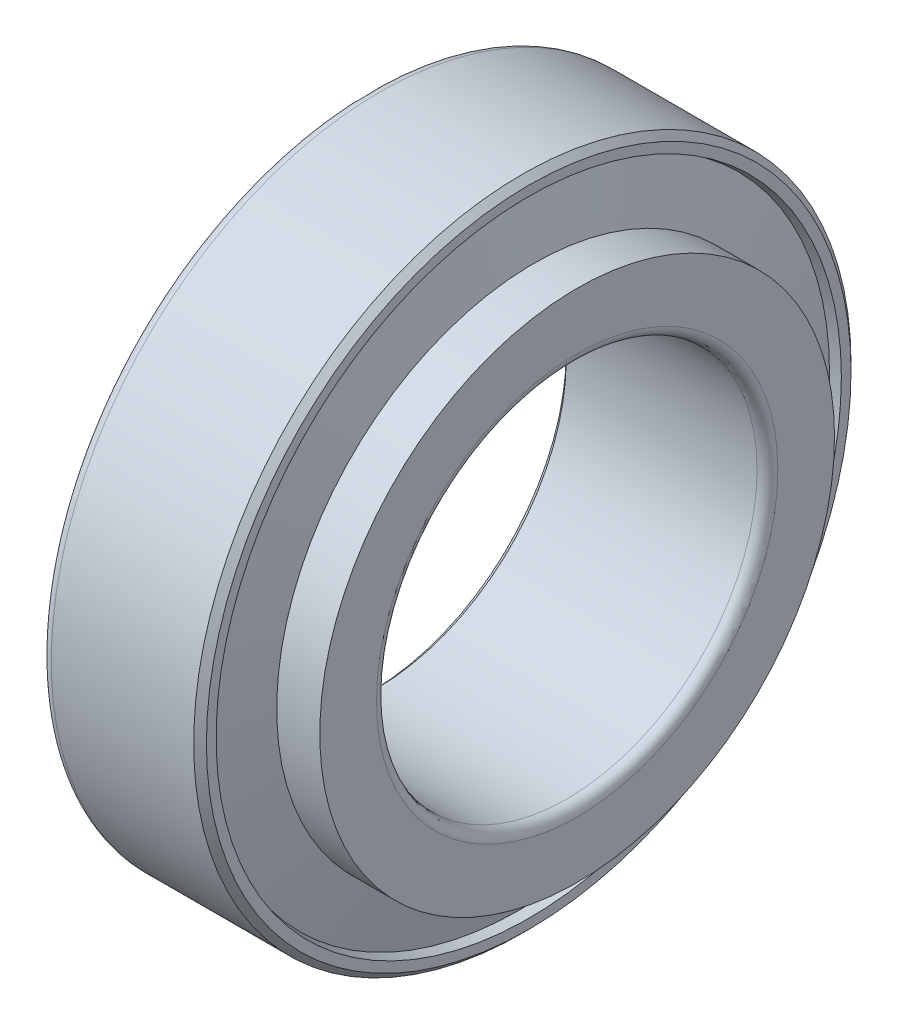
ISO-10303-21;
HEADER;
FILE_DESCRIPTION(('STEP AP214'),'2;1');
FILE_NAME('part.step','',(''),(''),'','','');
FILE_SCHEMA(('AUTOMOTIVE_DESIGN { 1 0 10303 214 1 1 1 1 }'));
ENDSEC;
DATA;
#1=APPLICATION_CONTEXT('core data for automotive mechanical design processes');
#2=APPLICATION_PROTOCOL_DEFINITION('international standard','automotive_design',2000,#1);
#3=PRODUCT_CONTEXT('',#1,'mechanical');
#4=PRODUCT('Part','Part','',(#3));
#5=PRODUCT_RELATED_PRODUCT_CATEGORY('part','',(#4));
#6=PRODUCT_DEFINITION_FORMATION('','',#4);
#7=PRODUCT_DEFINITION_CONTEXT('part definition',#1,'design');
#8=PRODUCT_DEFINITION('design','',#6,#7);
#9=PRODUCT_DEFINITION_SHAPE('','',#8);
#10=(LENGTH_UNIT() NAMED_UNIT(*) SI_UNIT(.MILLI.,.METRE.));
#11=(NAMED_UNIT(*) PLANE_ANGLE_UNIT() SI_UNIT($,.RADIAN.));
#12=(NAMED_UNIT(*) SI_UNIT($,.STERADIAN.) SOLID_ANGLE_UNIT());
#13=UNCERTAINTY_MEASURE_WITH_UNIT(LENGTH_MEASURE(1.E-05),#10,'distance_accuracy_value','');
#14=(GEOMETRIC_REPRESENTATION_CONTEXT(3) GLOBAL_UNCERTAINTY_ASSIGNED_CONTEXT((#13)) GLOBAL_UNIT_ASSIGNED_CONTEXT((#10,
#11,#12)) REPRESENTATION_CONTEXT('',''));
#15=CARTESIAN_POINT('',(0.,0.,0.));
#16=DIRECTION('',(0.,0.,1.));
#17=DIRECTION('',(1.,0.,0.));
#18=AXIS2_PLACEMENT_3D('',#15,#16,#17);
#19=CARTESIAN_POINT('',(-30.,0.,0.));
#20=DIRECTION('',(1.,0.,0.));
#21=DIRECTION('',(0.,0.,-1.));
#22=AXIS2_PLACEMENT_3D('',#19,#20,#21);
#23=CONICAL_SURFACE('',#22,39.447,0.244346095279199);
#24=CARTESIAN_POINT('',(-28.4532629417351,0.,0.));
#25=DIRECTION('',(-1.,0.,0.));
#26=DIRECTION('',(0.,0.,1.));
#27=AXIS2_PLACEMENT_3D('',#24,#25,#26);
#28=CIRCLE('',#27,39.8326448616607);
#29=CARTESIAN_POINT('',(-28.4532629417351,0.,39.8326448616607));
#30=VERTEX_POINT('',#29);
#31=EDGE_CURVE('E41',#30,#30,#28,.T.);
#32=ORIENTED_EDGE('',*,*,#31,.F.);
#33=EDGE_LOOP('',(#32));
#34=FACE_BOUND('',#33,.T.);
#35=CARTESIAN_POINT('',(-30.,0.,0.));
#36=DIRECTION('',(1.,0.,0.));
#37=DIRECTION('',(0.,0.,-1.));
#38=AXIS2_PLACEMENT_3D('',#35,#36,#37);
#39=CIRCLE('',#38,39.447);
#40=CARTESIAN_POINT('',(-30.,0.,-39.447));
#41=VERTEX_POINT('',#40);
#42=EDGE_CURVE('E53',#41,#41,#39,.T.);
#43=ORIENTED_EDGE('',*,*,#42,.F.);
#44=EDGE_LOOP('',(#43));
#45=FACE_BOUND('',#44,.T.);
#46=ADVANCED_FACE('F30',(#34,#45),#23,.F.);
#47=CARTESIAN_POINT('',(-7.,46.58,0.));
#48=DIRECTION('',(1.,0.,0.));
#49=DIRECTION('',(0.,0.,-1.));
#50=AXIS2_PLACEMENT_3D('',#47,#48,#49);
#51=PLANE('',#50);
#52=CARTESIAN_POINT('',(-7.,0.,0.));
#53=DIRECTION('',(1.,0.,0.));
#54=DIRECTION('',(0.,0.,-1.));
#55=AXIS2_PLACEMENT_3D('',#52,#53,#54);
#56=CIRCLE('',#55,46.58);
#57=CARTESIAN_POINT('',(-7.,0.,-46.58));
#58=VERTEX_POINT('',#57);
#59=EDGE_CURVE('E65',#58,#58,#56,.T.);
#60=ORIENTED_EDGE('',*,*,#59,.T.);
#61=EDGE_LOOP('',(#60));
#62=FACE_BOUND('',#61,.T.);
#63=CARTESIAN_POINT('',(-7.,0.,0.));
#64=DIRECTION('',(1.,0.,0.));
#65=DIRECTION('',(0.,0.,-1.));
#66=AXIS2_PLACEMENT_3D('',#63,#64,#65);
#67=CIRCLE('',#66,45.181544065393);
#68=CARTESIAN_POINT('',(-7.,0.,-45.181544065393));
#69=VERTEX_POINT('',#68);
#70=EDGE_CURVE('E50',#69,#69,#67,.T.);
#71=ORIENTED_EDGE('',*,*,#70,.F.);
#72=EDGE_LOOP('',(#71));
#73=FACE_BOUND('',#72,.T.);
#74=ADVANCED_FACE('F32',(#62,#73),#51,.T.);
#75=CARTESIAN_POINT('',(-8.36814140782197,0.,0.));
#76=DIRECTION('',(-1.,0.,0.));
#77=DIRECTION('',(0.,0.,1.));
#78=AXIS2_PLACEMENT_3D('',#75,#76,#77);
#79=CIRCLE('',#78,44.8404281005737);
#80=CARTESIAN_POINT('',(-8.36814140782197,0.,44.8404281005737));
#81=VERTEX_POINT('',#80);
#82=EDGE_CURVE('E45',#81,#81,#79,.F.);
#83=ORIENTED_EDGE('',*,*,#82,.F.);
#84=EDGE_LOOP('',(#83));
#85=FACE_BOUND('',#84,.T.);
#86=ORIENTED_EDGE('',*,*,#70,.T.);
#87=EDGE_LOOP('',(#86));
#88=FACE_BOUND('',#87,.T.);
#89=ADVANCED_FACE('F118',(#85,#88),#23,.F.);
#90=CARTESIAN_POINT('',(-30.,39.447,0.));
#91=DIRECTION('',(-1.,0.,0.));
#92=DIRECTION('',(0.,0.,1.));
#93=AXIS2_PLACEMENT_3D('',#90,#91,#92);
#94=PLANE('',#93);
#95=ORIENTED_EDGE('',*,*,#42,.T.);
#96=EDGE_LOOP('',(#95));
#97=FACE_BOUND('',#96,.T.);
#98=CARTESIAN_POINT('',(-30.,0.,0.));
#99=DIRECTION('',(1.,0.,0.));
#100=DIRECTION('',(0.,0.,-1.));
#101=AXIS2_PLACEMENT_3D('',#98,#99,#100);
#102=CIRCLE('',#101,46.);
#103=CARTESIAN_POINT('',(-30.,0.,-46.));
#104=VERTEX_POINT('',#103);
#105=EDGE_CURVE('E56',#104,#104,#102,.T.);
#106=ORIENTED_EDGE('',*,*,#105,.F.);
#107=EDGE_LOOP('',(#106));
#108=FACE_BOUND('',#107,.T.);
#109=ADVANCED_FACE('F127',(#97,#108),#94,.T.);
#110=CARTESIAN_POINT('',(-28.5,0.,0.));
#111=DIRECTION('',(1.,0.,0.));
#112=DIRECTION('',(0.,0.,-1.));
#113=AXIS2_PLACEMENT_3D('',#110,#111,#112);
#114=TOROIDAL_SURFACE('',#113,46.,1.5);
#115=ORIENTED_EDGE('',*,*,#105,.T.);
#116=EDGE_LOOP('',(#115));
#117=FACE_BOUND('',#116,.T.);
#118=CARTESIAN_POINT('',(-28.5,0.,0.));
#119=DIRECTION('',(1.,0.,0.));
#120=DIRECTION('',(0.,0.,-1.));
#121=AXIS2_PLACEMENT_3D('',#118,#119,#120);
#122=CIRCLE('',#121,47.5);
#123=CARTESIAN_POINT('',(-28.5,0.,-47.5));
#124=VERTEX_POINT('',#123);
#125=EDGE_CURVE('E59',#124,#124,#122,.T.);
#126=ORIENTED_EDGE('',*,*,#125,.F.);
#127=EDGE_LOOP('',(#126));
#128=FACE_BOUND('',#127,.T.);
#129=ADVANCED_FACE('F132',(#117,#128),#114,.T.);
#130=CARTESIAN_POINT('',(-42.5,0.,0.));
#131=DIRECTION('',(1.,0.,0.));
#132=DIRECTION('',(0.,0.,-1.));
#133=AXIS2_PLACEMENT_3D('',#130,#131,#132);
#134=CYLINDRICAL_SURFACE('',#133,47.5);
#135=ORIENTED_EDGE('',*,*,#125,.T.);
#136=EDGE_LOOP('',(#135));
#137=FACE_BOUND('',#136,.T.);
#138=CARTESIAN_POINT('',(-7.92,0.,0.));
#139=DIRECTION('',(1.,0.,0.));
#140=DIRECTION('',(0.,0.,-1.));
#141=AXIS2_PLACEMENT_3D('',#138,#139,#140);
#142=CIRCLE('',#141,47.5);
#143=CARTESIAN_POINT('',(-7.92,0.,-47.5));
#144=VERTEX_POINT('',#143);
#145=EDGE_CURVE('E62',#144,#144,#142,.T.);
#146=ORIENTED_EDGE('',*,*,#145,.F.);
#147=EDGE_LOOP('',(#146));
#148=FACE_BOUND('',#147,.T.);
#149=ADVANCED_FACE('F154',(#137,#148),#134,.T.);
#150=CARTESIAN_POINT('',(-7.,0.,0.));
#151=DIRECTION('',(-1.,0.,0.));
#152=DIRECTION('',(0.,0.,1.));
#153=AXIS2_PLACEMENT_3D('',#150,#151,#152);
#154=CONICAL_SURFACE('',#153,46.58,0.785398163397445);
#155=ORIENTED_EDGE('',*,*,#145,.T.);
#156=EDGE_LOOP('',(#155));
#157=FACE_BOUND('',#156,.T.);
#158=ORIENTED_EDGE('',*,*,#59,.F.);
#159=EDGE_LOOP('',(#158));
#160=FACE_BOUND('',#159,.T.);
#161=ADVANCED_FACE('F148',(#157,#160),#154,.T.);
#162=CARTESIAN_POINT('',(-28.5,0.,0.));
#163=DIRECTION('',(-1.,0.,0.));
#164=DIRECTION('',(0.,0.,1.));
#165=AXIS2_PLACEMENT_3D('',#162,#163,#164);
#166=CONICAL_SURFACE('',#165,40.020096963839,1.3264502315157);
#167=CARTESIAN_POINT('',(-26.4349005407309,0.,0.));
#168=DIRECTION('',(-1.,0.,0.));
#169=DIRECTION('',(0.,0.,1.));
#170=AXIS2_PLACEMENT_3D('',#167,#168,#169);
#171=CIRCLE('',#170,31.7374354267472);
#172=CARTESIAN_POINT('',(-26.4349005407309,0.,31.7374354267472));
#173=VERTEX_POINT('',#172);
#174=EDGE_CURVE('E10',#173,#173,#171,.T.);
#175=ORIENTED_EDGE('',*,*,#174,.F.);
#176=EDGE_LOOP('',(#175));
#177=FACE_BOUND('',#176,.T.);
#178=ORIENTED_EDGE('',*,*,#31,.T.);
#179=EDGE_LOOP('',(#178));
#180=FACE_BOUND('',#179,.T.);
#181=ADVANCED_FACE('F142',(#177,#180),#166,.F.);
#182=CARTESIAN_POINT('',(-26.322702939603,0.,0.));
#183=DIRECTION('',(1.,0.,0.));
#184=DIRECTION('',(0.,0.,-1.));
#185=AXIS2_PLACEMENT_3D('',#182,#183,#184);
#186=CONICAL_SURFACE('',#185,31.2874354273551,0.2443460952792);
#187=CARTESIAN_POINT('',(-26.3124536014056,0.,0.));
#188=DIRECTION('',(-1.,0.,0.));
#189=DIRECTION('',(0.,0.,1.));
#190=AXIS2_PLACEMENT_3D('',#187,#188,#189);
#191=CIRCLE('',#190,31.2899908743783);
#192=CARTESIAN_POINT('',(-26.3124536014056,0.,31.2899908743783));
#193=VERTEX_POINT('',#192);
#194=EDGE_CURVE('E37',#193,#193,#191,.F.);
#195=ORIENTED_EDGE('',*,*,#194,.F.);
#196=EDGE_LOOP('',(#195));
#197=FACE_BOUND('',#196,.T.);
#198=CARTESIAN_POINT('',(-6.2375814056899,0.,0.));
#199=DIRECTION('',(1.,0.,0.));
#200=DIRECTION('',(0.,0.,-1.));
#201=AXIS2_PLACEMENT_3D('',#198,#199,#200);
#202=CIRCLE('',#201,36.295218666268);
#203=CARTESIAN_POINT('',(-6.2375814056899,0.,-36.295218666268));
#204=VERTEX_POINT('',#203);
#205=EDGE_CURVE('E68',#204,#204,#202,.T.);
#206=ORIENTED_EDGE('',*,*,#205,.T.);
#207=EDGE_LOOP('',(#206));
#208=FACE_BOUND('',#207,.T.);
#209=ADVANCED_FACE('F113',(#197,#208),#186,.F.);
#210=CARTESIAN_POINT('',(-6.2375814056899,0.,0.));
#211=DIRECTION('',(-1.,0.,0.));
#212=DIRECTION('',(0.,0.,1.));
#213=AXIS2_PLACEMENT_3D('',#210,#211,#212);
#214=CONICAL_SURFACE('',#213,36.295218666268,1.3264502315157);
#215=ORIENTED_EDGE('',*,*,#82,.T.);
#216=EDGE_LOOP('',(#215));
#217=FACE_BOUND('',#216,.T.);
#218=ORIENTED_EDGE('',*,*,#205,.F.);
#219=EDGE_LOOP('',(#218));
#220=FACE_BOUND('',#219,.T.);
#221=ADVANCED_FACE('F105',(#217,#220),#214,.T.);
#222=CARTESIAN_POINT('',(-26.3118164567514,0.,0.));
#223=DIRECTION('',(-1.,0.,0.));
#224=DIRECTION('',(0.,0.,1.));
#225=AXIS2_PLACEMENT_3D('',#222,#223,#224);
#226=CONICAL_SURFACE('',#225,31.2874354267472,1.3264502315157);
#227=ORIENTED_EDGE('',*,*,#194,.T.);
#228=EDGE_LOOP('',(#227));
#229=FACE_BOUND('',#228,.T.);
#230=CARTESIAN_POINT('',(-26.3118164567514,0.,0.));
#231=DIRECTION('',(1.,0.,0.));
#232=DIRECTION('',(0.,0.,-1.));
#233=AXIS2_PLACEMENT_3D('',#230,#231,#232);
#234=CIRCLE('',#233,31.2874354267472);
#235=CARTESIAN_POINT('',(-26.3118164567514,0.,-31.2874354267472));
#236=VERTEX_POINT('',#235);
#237=EDGE_CURVE('E95',#236,#236,#234,.T.);
#238=ORIENTED_EDGE('',*,*,#237,.F.);
#239=EDGE_LOOP('',(#238));
#240=FACE_BOUND('',#239,.T.);
#241=ADVANCED_FACE('F102',(#229,#240),#226,.T.);
#242=CARTESIAN_POINT('',(-42.5,0.,0.));
#243=DIRECTION('',(1.,0.,0.));
#244=DIRECTION('',(0.,0.,-1.));
#245=AXIS2_PLACEMENT_3D('',#242,#243,#244);
#246=CYLINDRICAL_SURFACE('',#245,31.7374354267472);
#247=ORIENTED_EDGE('',*,*,#174,.T.);
#248=EDGE_LOOP('',(#247));
#249=FACE_BOUND('',#248,.T.);
#250=CARTESIAN_POINT('',(-30.,0.,0.));
#251=DIRECTION('',(1.,0.,0.));
#252=DIRECTION('',(0.,0.,-1.));
#253=AXIS2_PLACEMENT_3D('',#250,#251,#252);
#254=CIRCLE('',#253,31.7374354267472);
#255=CARTESIAN_POINT('',(-30.,0.,-31.7374354267472));
#256=VERTEX_POINT('',#255);
#257=EDGE_CURVE('E71',#256,#256,#254,.T.);
#258=ORIENTED_EDGE('',*,*,#257,.T.);
#259=EDGE_LOOP('',(#258));
#260=FACE_BOUND('',#259,.T.);
#261=ADVANCED_FACE('F104',(#249,#260),#246,.T.);
#262=CARTESIAN_POINT('',(-30.,31.7374354267472,0.));
#263=DIRECTION('',(-1.,0.,0.));
#264=DIRECTION('',(0.,0.,1.));
#265=AXIS2_PLACEMENT_3D('',#262,#263,#264);
#266=PLANE('',#265);
#267=CARTESIAN_POINT('',(-30.,0.,0.));
#268=DIRECTION('',(1.,0.,0.));
#269=DIRECTION('',(0.,0.,-1.));
#270=AXIS2_PLACEMENT_3D('',#267,#268,#269);
#271=CIRCLE('',#270,28.42);
#272=CARTESIAN_POINT('',(-30.,0.,-28.42));
#273=VERTEX_POINT('',#272);
#274=EDGE_CURVE('E74',#273,#273,#271,.T.);
#275=ORIENTED_EDGE('',*,*,#274,.T.);
#276=EDGE_LOOP('',(#275));
#277=FACE_BOUND('',#276,.T.);
#278=ORIENTED_EDGE('',*,*,#257,.F.);
#279=EDGE_LOOP('',(#278));
#280=FACE_BOUND('',#279,.T.);
#281=ADVANCED_FACE('F111',(#277,#280),#266,.T.);
#282=CARTESIAN_POINT('',(-30.,0.,0.));
#283=DIRECTION('',(-1.,0.,0.));
#284=DIRECTION('',(0.,0.,1.));
#285=AXIS2_PLACEMENT_3D('',#282,#283,#284);
#286=CONICAL_SURFACE('',#285,28.42,0.785398163397448);
#287=CARTESIAN_POINT('',(-29.08,0.,0.));
#288=DIRECTION('',(1.,0.,0.));
#289=DIRECTION('',(0.,0.,-1.));
#290=AXIS2_PLACEMENT_3D('',#287,#288,#289);
#291=CIRCLE('',#290,27.5);
#292=CARTESIAN_POINT('',(-29.08,0.,-27.5));
#293=VERTEX_POINT('',#292);
#294=EDGE_CURVE('E77',#293,#293,#291,.T.);
#295=ORIENTED_EDGE('',*,*,#294,.T.);
#296=EDGE_LOOP('',(#295));
#297=FACE_BOUND('',#296,.T.);
#298=ORIENTED_EDGE('',*,*,#274,.F.);
#299=EDGE_LOOP('',(#298));
#300=FACE_BOUND('',#299,.T.);
#301=ADVANCED_FACE('F212',(#297,#300),#286,.F.);
#302=CARTESIAN_POINT('',(-42.5,0.,0.));
#303=DIRECTION('',(1.,0.,0.));
#304=DIRECTION('',(0.,0.,-1.));
#305=AXIS2_PLACEMENT_3D('',#302,#303,#304);
#306=CYLINDRICAL_SURFACE('',#305,27.5);
#307=CARTESIAN_POINT('',(-1.5,0.,0.));
#308=DIRECTION('',(1.,0.,0.));
#309=DIRECTION('',(0.,0.,-1.));
#310=AXIS2_PLACEMENT_3D('',#307,#308,#309);
#311=CIRCLE('',#310,27.5);
#312=CARTESIAN_POINT('',(-1.5,0.,-27.5));
#313=VERTEX_POINT('',#312);
#314=EDGE_CURVE('E80',#313,#313,#311,.T.);
#315=ORIENTED_EDGE('',*,*,#314,.T.);
#316=EDGE_LOOP('',(#315));
#317=FACE_BOUND('',#316,.T.);
#318=ORIENTED_EDGE('',*,*,#294,.F.);
#319=EDGE_LOOP('',(#318));
#320=FACE_BOUND('',#319,.T.);
#321=ADVANCED_FACE('F222',(#317,#320),#306,.F.);
#322=CARTESIAN_POINT('',(-1.5,0.,0.));
#323=DIRECTION('',(1.,0.,0.));
#324=DIRECTION('',(0.,0.,-1.));
#325=AXIS2_PLACEMENT_3D('',#322,#323,#324);
#326=TOROIDAL_SURFACE('',#325,29.,1.5);
#327=CARTESIAN_POINT('',(0.,0.,0.));
#328=DIRECTION('',(1.,0.,0.));
#329=DIRECTION('',(0.,0.,-1.));
#330=AXIS2_PLACEMENT_3D('',#327,#328,#329);
#331=CIRCLE('',#330,29.);
#332=CARTESIAN_POINT('',(0.,0.,-29.));
#333=VERTEX_POINT('',#332);
#334=EDGE_CURVE('E83',#333,#333,#331,.T.);
#335=ORIENTED_EDGE('',*,*,#334,.T.);
#336=EDGE_LOOP('',(#335));
#337=FACE_BOUND('',#336,.T.);
#338=ORIENTED_EDGE('',*,*,#314,.F.);
#339=EDGE_LOOP('',(#338));
#340=FACE_BOUND('',#339,.T.);
#341=ADVANCED_FACE('F232',(#337,#340),#326,.T.);
#342=CARTESIAN_POINT('',(0.,29.,0.));
#343=DIRECTION('',(1.,0.,0.));
#344=DIRECTION('',(0.,0.,-1.));
#345=AXIS2_PLACEMENT_3D('',#342,#343,#344);
#346=PLANE('',#345);
#347=CARTESIAN_POINT('',(0.,0.,0.));
#348=DIRECTION('',(1.,0.,0.));
#349=DIRECTION('',(0.,0.,-1.));
#350=AXIS2_PLACEMENT_3D('',#347,#348,#349);
#351=CIRCLE('',#350,37.1952186656601);
#352=CARTESIAN_POINT('',(0.,0.,-37.1952186656601));
#353=VERTEX_POINT('',#352);
#354=EDGE_CURVE('E86',#353,#353,#351,.T.);
#355=ORIENTED_EDGE('',*,*,#354,.T.);
#356=EDGE_LOOP('',(#355));
#357=FACE_BOUND('',#356,.T.);
#358=ORIENTED_EDGE('',*,*,#334,.F.);
#359=EDGE_LOOP('',(#358));
#360=FACE_BOUND('',#359,.T.);
#361=ADVANCED_FACE('F242',(#357,#360),#346,.T.);
#362=CARTESIAN_POINT('',(-42.5,0.,0.));
#363=DIRECTION('',(1.,0.,0.));
#364=DIRECTION('',(0.,0.,-1.));
#365=AXIS2_PLACEMENT_3D('',#362,#363,#364);
#366=CYLINDRICAL_SURFACE('',#365,37.1952186656601);
#367=CARTESIAN_POINT('',(-6.22669492283825,0.,0.));
#368=DIRECTION('',(1.,0.,0.));
#369=DIRECTION('',(0.,0.,-1.));
#370=AXIS2_PLACEMENT_3D('',#367,#368,#369);
#371=CIRCLE('',#370,37.1952186656601);
#372=CARTESIAN_POINT('',(-6.22669492283825,0.,-37.1952186656601));
#373=VERTEX_POINT('',#372);
#374=EDGE_CURVE('E89',#373,#373,#371,.T.);
#375=ORIENTED_EDGE('',*,*,#374,.T.);
#376=EDGE_LOOP('',(#375));
#377=FACE_BOUND('',#376,.T.);
#378=ORIENTED_EDGE('',*,*,#354,.F.);
#379=EDGE_LOOP('',(#378));
#380=FACE_BOUND('',#379,.T.);
#381=ADVANCED_FACE('F252',(#377,#380),#366,.T.);
#382=CARTESIAN_POINT('',(-6.22669492283825,37.1952186656601,0.));
#383=DIRECTION('',(-1.,0.,0.));
#384=DIRECTION('',(0.,0.,1.));
#385=AXIS2_PLACEMENT_3D('',#382,#383,#384);
#386=PLANE('',#385);
#387=CARTESIAN_POINT('',(-6.22669492283825,0.,0.));
#388=DIRECTION('',(1.,0.,0.));
#389=DIRECTION('',(0.,0.,-1.));
#390=AXIS2_PLACEMENT_3D('',#387,#388,#389);
#391=CIRCLE('',#390,36.2952186656601);
#392=CARTESIAN_POINT('',(-6.22669492283825,0.,-36.2952186656601));
#393=VERTEX_POINT('',#392);
#394=EDGE_CURVE('E92',#393,#393,#391,.T.);
#395=ORIENTED_EDGE('',*,*,#394,.T.);
#396=EDGE_LOOP('',(#395));
#397=FACE_BOUND('',#396,.T.);
#398=ORIENTED_EDGE('',*,*,#374,.F.);
#399=EDGE_LOOP('',(#398));
#400=FACE_BOUND('',#399,.T.);
#401=ADVANCED_FACE('F262',(#397,#400),#386,.T.);
#402=CARTESIAN_POINT('',(-6.22669492283825,0.,0.));
#403=DIRECTION('',(1.,0.,0.));
#404=DIRECTION('',(0.,0.,-1.));
#405=AXIS2_PLACEMENT_3D('',#402,#403,#404);
#406=CONICAL_SURFACE('',#405,36.2952186656601,0.2443460952792);
#407=ORIENTED_EDGE('',*,*,#237,.T.);
#408=EDGE_LOOP('',(#407));
#409=FACE_BOUND('',#408,.T.);
#410=ORIENTED_EDGE('',*,*,#394,.F.);
#411=EDGE_LOOP('',(#410));
#412=FACE_BOUND('',#411,.T.);
#413=ADVANCED_FACE('F99',(#409,#412),#406,.T.);
#414=CLOSED_SHELL('',(#46,#74,#89,#109,#129,#149,#161,#181,#209,#221,#241,#261,#281,#301,#321,
#341,#361,#381,#401,#413));
#415=MANIFOLD_SOLID_BREP('B2',#414);
#416=ADVANCED_BREP_SHAPE_REPRESENTATION('',(#18,#415),#14);
#417=SHAPE_DEFINITION_REPRESENTATION(#9,#416);
ENDSEC;
END-ISO-10303-21;
